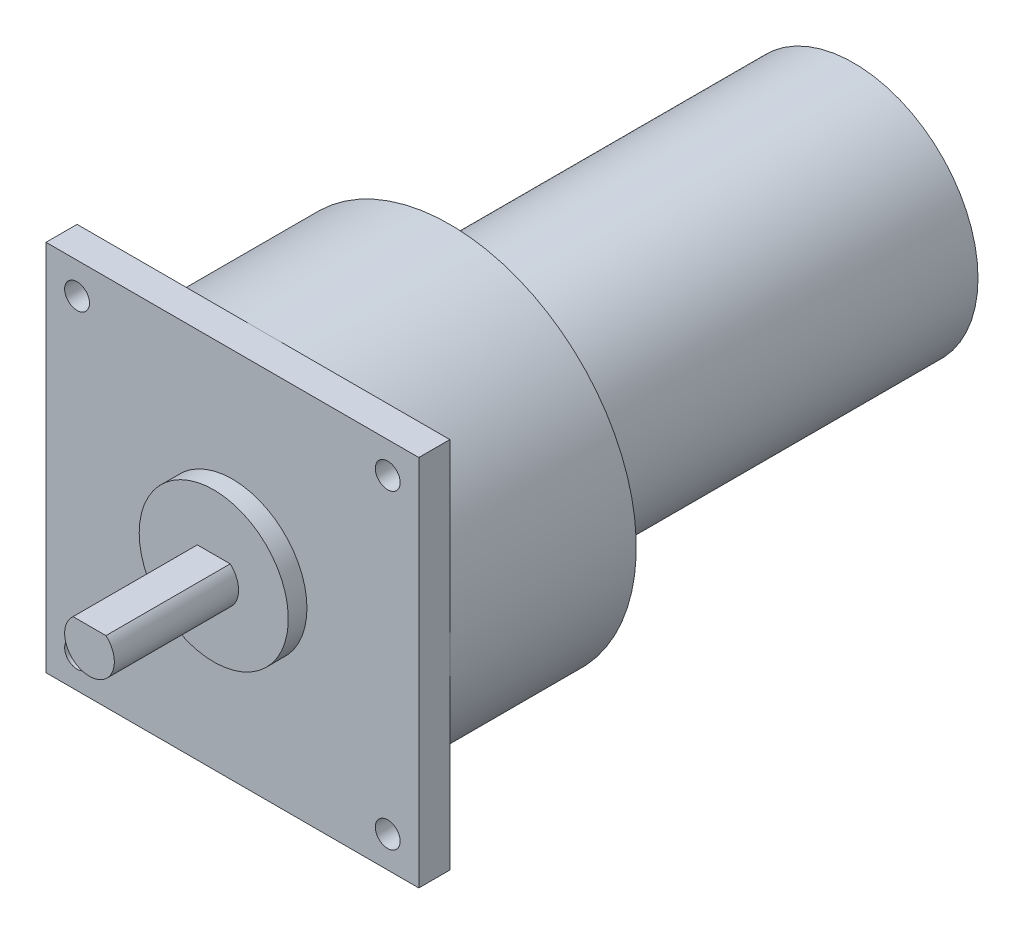
ISO-10303-21;
HEADER;
FILE_DESCRIPTION(('STEP AP214'),'2;1');
FILE_NAME('part.step','',(''),(''),'','','');
FILE_SCHEMA(('AUTOMOTIVE_DESIGN { 1 0 10303 214 1 1 1 1 }'));
ENDSEC;
DATA;
#1=APPLICATION_CONTEXT('core data for automotive mechanical design processes');
#2=APPLICATION_PROTOCOL_DEFINITION('international standard','automotive_design',2000,#1);
#3=PRODUCT_CONTEXT('',#1,'mechanical');
#4=PRODUCT('Part','Part','',(#3));
#5=PRODUCT_RELATED_PRODUCT_CATEGORY('part','',(#4));
#6=PRODUCT_DEFINITION_FORMATION('','',#4);
#7=PRODUCT_DEFINITION_CONTEXT('part definition',#1,'design');
#8=PRODUCT_DEFINITION('design','',#6,#7);
#9=PRODUCT_DEFINITION_SHAPE('','',#8);
#10=(LENGTH_UNIT() NAMED_UNIT(*) SI_UNIT(.MILLI.,.METRE.));
#11=(NAMED_UNIT(*) PLANE_ANGLE_UNIT() SI_UNIT($,.RADIAN.));
#12=(NAMED_UNIT(*) SI_UNIT($,.STERADIAN.) SOLID_ANGLE_UNIT());
#13=UNCERTAINTY_MEASURE_WITH_UNIT(LENGTH_MEASURE(1.E-05),#10,'distance_accuracy_value','');
#14=(GEOMETRIC_REPRESENTATION_CONTEXT(3) GLOBAL_UNCERTAINTY_ASSIGNED_CONTEXT((#13)) GLOBAL_UNIT_ASSIGNED_CONTEXT((#10,
#11,#12)) REPRESENTATION_CONTEXT('',''));
#15=CARTESIAN_POINT('',(0.,0.,0.));
#16=DIRECTION('',(0.,0.,1.));
#17=DIRECTION('',(1.,0.,0.));
#18=AXIS2_PLACEMENT_3D('',#15,#16,#17);
#19=CARTESIAN_POINT('',(0.,0.,-30.));
#20=DIRECTION('',(0.,0.,-1.));
#21=DIRECTION('',(-1.,0.,0.));
#22=AXIS2_PLACEMENT_3D('',#19,#20,#21);
#23=PLANE('',#22);
#24=CARTESIAN_POINT('',(0.,0.,-30.));
#25=DIRECTION('',(0.,0.,-1.));
#26=DIRECTION('',(-1.,0.,0.));
#27=AXIS2_PLACEMENT_3D('',#24,#25,#26);
#28=CIRCLE('',#27,30.);
#29=CARTESIAN_POINT('',(-30.,0.,-30.));
#30=VERTEX_POINT('',#29);
#31=EDGE_CURVE('E126',#30,#30,#28,.T.);
#32=ORIENTED_EDGE('',*,*,#31,.T.);
#33=EDGE_LOOP('',(#32));
#34=FACE_BOUND('',#33,.T.);
#35=CARTESIAN_POINT('',(0.,0.,-30.));
#36=DIRECTION('',(0.,0.,-1.));
#37=DIRECTION('',(-1.,0.,0.));
#38=AXIS2_PLACEMENT_3D('',#35,#36,#37);
#39=CIRCLE('',#38,20.);
#40=CARTESIAN_POINT('',(-20.,0.,-30.));
#41=VERTEX_POINT('',#40);
#42=EDGE_CURVE('E442',#41,#41,#39,.T.);
#43=ORIENTED_EDGE('',*,*,#42,.F.);
#44=EDGE_LOOP('',(#43));
#45=FACE_BOUND('',#44,.T.);
#46=ADVANCED_FACE('F35',(#34,#45),#23,.T.);
#47=CARTESIAN_POINT('',(0.,0.,0.));
#48=DIRECTION('',(0.,0.,1.));
#49=DIRECTION('',(1.,0.,0.));
#50=AXIS2_PLACEMENT_3D('',#47,#48,#49);
#51=PLANE('',#50);
#52=CARTESIAN_POINT('',(-25.,25.,0.));
#53=DIRECTION('',(0.,0.,-1.));
#54=DIRECTION('',(-1.,0.,0.));
#55=AXIS2_PLACEMENT_3D('',#52,#53,#54);
#56=CIRCLE('',#55,2.);
#57=CARTESIAN_POINT('',(-27.,25.,0.));
#58=VERTEX_POINT('',#57);
#59=EDGE_CURVE('E168',#58,#58,#56,.T.);
#60=ORIENTED_EDGE('',*,*,#59,.F.);
#61=EDGE_LOOP('',(#60));
#62=FACE_BOUND('',#61,.T.);
#63=CARTESIAN_POINT('',(0.,0.,0.));
#64=DIRECTION('',(0.,0.,-1.));
#65=DIRECTION('',(-1.,0.,0.));
#66=AXIS2_PLACEMENT_3D('',#63,#64,#65);
#67=CIRCLE('',#66,30.);
#68=CARTESIAN_POINT('',(-30.,0.,0.));
#69=VERTEX_POINT('',#68);
#70=CARTESIAN_POINT('',(0.,30.,0.));
#71=VERTEX_POINT('',#70);
#72=EDGE_CURVE('E46',#69,#71,#67,.T.);
#73=ORIENTED_EDGE('',*,*,#72,.F.);
#74=DIRECTION('',(0.,-1.,0.));
#75=VECTOR('',#74,1.);
#76=CARTESIAN_POINT('',(-30.,30.,0.));
#77=LINE('',#76,#75);
#78=CARTESIAN_POINT('',(-30.,30.,0.));
#79=VERTEX_POINT('',#78);
#80=EDGE_CURVE('E105',#79,#69,#77,.T.);
#81=ORIENTED_EDGE('',*,*,#80,.F.);
#82=DIRECTION('',(-1.,0.,0.));
#83=VECTOR('',#82,1.);
#84=CARTESIAN_POINT('',(-30.,30.,0.));
#85=LINE('',#84,#83);
#86=EDGE_CURVE('E123',#71,#79,#85,.T.);
#87=ORIENTED_EDGE('',*,*,#86,.F.);
#88=EDGE_LOOP('',(#73,#81,#87));
#89=FACE_BOUND('',#88,.T.);
#90=ADVANCED_FACE('F122',(#62,#89),#51,.F.);
#91=CARTESIAN_POINT('',(25.,25.,0.));
#92=DIRECTION('',(0.,0.,-1.));
#93=DIRECTION('',(-1.,0.,0.));
#94=AXIS2_PLACEMENT_3D('',#91,#92,#93);
#95=CIRCLE('',#94,2.);
#96=CARTESIAN_POINT('',(23.,25.,0.));
#97=VERTEX_POINT('',#96);
#98=EDGE_CURVE('E174',#97,#97,#95,.T.);
#99=ORIENTED_EDGE('',*,*,#98,.F.);
#100=EDGE_LOOP('',(#99));
#101=FACE_BOUND('',#100,.T.);
#102=CARTESIAN_POINT('',(30.,0.,0.));
#103=VERTEX_POINT('',#102);
#104=EDGE_CURVE('E11',#71,#103,#67,.T.);
#105=ORIENTED_EDGE('',*,*,#104,.F.);
#106=CARTESIAN_POINT('',(30.,30.,0.));
#107=VERTEX_POINT('',#106);
#108=EDGE_CURVE('E120',#107,#71,#85,.T.);
#109=ORIENTED_EDGE('',*,*,#108,.F.);
#110=DIRECTION('',(0.,1.,0.));
#111=VECTOR('',#110,1.);
#112=CARTESIAN_POINT('',(30.,30.,0.));
#113=LINE('',#112,#111);
#114=EDGE_CURVE('E180',#103,#107,#113,.T.);
#115=ORIENTED_EDGE('',*,*,#114,.F.);
#116=EDGE_LOOP('',(#105,#109,#115));
#117=FACE_BOUND('',#116,.T.);
#118=ADVANCED_FACE('F206',(#101,#117),#51,.F.);
#119=CARTESIAN_POINT('',(24.9999999999995,-25.,0.));
#120=DIRECTION('',(0.,0.,-1.));
#121=DIRECTION('',(-1.,0.,0.));
#122=AXIS2_PLACEMENT_3D('',#119,#120,#121);
#123=CIRCLE('',#122,2.);
#124=CARTESIAN_POINT('',(22.9999999999995,-25.,0.));
#125=VERTEX_POINT('',#124);
#126=EDGE_CURVE('E155',#125,#125,#123,.T.);
#127=ORIENTED_EDGE('',*,*,#126,.F.);
#128=EDGE_LOOP('',(#127));
#129=FACE_BOUND('',#128,.T.);
#130=CARTESIAN_POINT('',(0.,-30.,0.));
#131=VERTEX_POINT('',#130);
#132=EDGE_CURVE('E44',#103,#131,#67,.T.);
#133=ORIENTED_EDGE('',*,*,#132,.F.);
#134=CARTESIAN_POINT('',(30.,-30.,0.));
#135=VERTEX_POINT('',#134);
#136=EDGE_CURVE('E191',#135,#103,#113,.T.);
#137=ORIENTED_EDGE('',*,*,#136,.F.);
#138=DIRECTION('',(1.,0.,0.));
#139=VECTOR('',#138,1.);
#140=CARTESIAN_POINT('',(-30.,-30.,0.));
#141=LINE('',#140,#139);
#142=EDGE_CURVE('E115',#131,#135,#141,.T.);
#143=ORIENTED_EDGE('',*,*,#142,.F.);
#144=EDGE_LOOP('',(#133,#137,#143));
#145=FACE_BOUND('',#144,.T.);
#146=ADVANCED_FACE('F208',(#129,#145),#51,.F.);
#147=CARTESIAN_POINT('',(-25.0000000000005,-25.,0.));
#148=DIRECTION('',(0.,0.,-1.));
#149=DIRECTION('',(-1.,0.,0.));
#150=AXIS2_PLACEMENT_3D('',#147,#148,#149);
#151=CIRCLE('',#150,2.);
#152=CARTESIAN_POINT('',(-27.0000000000005,-25.,0.));
#153=VERTEX_POINT('',#152);
#154=EDGE_CURVE('E162',#153,#153,#151,.T.);
#155=ORIENTED_EDGE('',*,*,#154,.F.);
#156=EDGE_LOOP('',(#155));
#157=FACE_BOUND('',#156,.T.);
#158=EDGE_CURVE('E59',#131,#69,#67,.T.);
#159=ORIENTED_EDGE('',*,*,#158,.F.);
#160=CARTESIAN_POINT('',(-30.,-30.,0.));
#161=VERTEX_POINT('',#160);
#162=EDGE_CURVE('E119',#161,#131,#141,.T.);
#163=ORIENTED_EDGE('',*,*,#162,.F.);
#164=EDGE_CURVE('E108',#69,#161,#77,.T.);
#165=ORIENTED_EDGE('',*,*,#164,.F.);
#166=EDGE_LOOP('',(#159,#163,#165));
#167=FACE_BOUND('',#166,.T.);
#168=ADVANCED_FACE('F117',(#157,#167),#51,.F.);
#169=CARTESIAN_POINT('',(0.,0.,8.));
#170=DIRECTION('',(0.,0.,-1.));
#171=DIRECTION('',(-1.,0.,0.));
#172=AXIS2_PLACEMENT_3D('',#169,#170,#171);
#173=PLANE('',#172);
#174=CARTESIAN_POINT('',(0.,0.,8.));
#175=DIRECTION('',(0.,0.,-1.));
#176=DIRECTION('',(-1.,0.,0.));
#177=AXIS2_PLACEMENT_3D('',#174,#175,#176);
#178=CIRCLE('',#177,12.);
#179=CARTESIAN_POINT('',(-12.,0.,8.));
#180=VERTEX_POINT('',#179);
#181=EDGE_CURVE('E153',#180,#180,#178,.T.);
#182=ORIENTED_EDGE('',*,*,#181,.F.);
#183=EDGE_LOOP('',(#182));
#184=FACE_BOUND('',#183,.T.);
#185=CARTESIAN_POINT('',(0.,0.,8.));
#186=DIRECTION('',(0.,0.,1.));
#187=DIRECTION('',(1.,0.,0.));
#188=AXIS2_PLACEMENT_3D('',#185,#186,#187);
#189=CIRCLE('',#188,4.);
#190=CARTESIAN_POINT('',(-2.64575131106459,3.,8.));
#191=VERTEX_POINT('',#190);
#192=CARTESIAN_POINT('',(2.64575131106459,3.,8.));
#193=VERTEX_POINT('',#192);
#194=EDGE_CURVE('E143',#191,#193,#189,.T.);
#195=ORIENTED_EDGE('',*,*,#194,.F.);
#196=DIRECTION('',(-1.,0.,0.));
#197=VECTOR('',#196,1.);
#198=CARTESIAN_POINT('',(-2.64575131106459,3.,8.));
#199=LINE('',#198,#197);
#200=EDGE_CURVE('E140',#193,#191,#199,.T.);
#201=ORIENTED_EDGE('',*,*,#200,.F.);
#202=EDGE_LOOP('',(#195,#201));
#203=FACE_BOUND('',#202,.T.);
#204=ADVANCED_FACE('F247',(#184,#203),#173,.F.);
#205=CARTESIAN_POINT('',(30.,30.,5.));
#206=DIRECTION('',(-1.,0.,0.));
#207=DIRECTION('',(0.,-1.,0.));
#208=AXIS2_PLACEMENT_3D('',#205,#206,#207);
#209=PLANE('',#208);
#210=ORIENTED_EDGE('',*,*,#136,.T.);
#211=ORIENTED_EDGE('',*,*,#114,.T.);
#212=DIRECTION('',(0.,0.,-1.));
#213=VECTOR('',#212,1.);
#214=CARTESIAN_POINT('',(30.,30.,5.));
#215=LINE('',#214,#213);
#216=CARTESIAN_POINT('',(30.,30.,5.));
#217=VERTEX_POINT('',#216);
#218=EDGE_CURVE('E39',#217,#107,#215,.T.);
#219=ORIENTED_EDGE('',*,*,#218,.F.);
#220=DIRECTION('',(0.,1.,0.));
#221=VECTOR('',#220,1.);
#222=CARTESIAN_POINT('',(30.,30.,5.));
#223=LINE('',#222,#221);
#224=CARTESIAN_POINT('',(30.,-30.,5.));
#225=VERTEX_POINT('',#224);
#226=EDGE_CURVE('E181',#225,#217,#223,.T.);
#227=ORIENTED_EDGE('',*,*,#226,.F.);
#228=DIRECTION('',(0.,0.,-1.));
#229=VECTOR('',#228,1.);
#230=CARTESIAN_POINT('',(30.,-30.,5.));
#231=LINE('',#230,#229);
#232=EDGE_CURVE('E190',#225,#135,#231,.T.);
#233=ORIENTED_EDGE('',*,*,#232,.T.);
#234=EDGE_LOOP('',(#210,#211,#219,#227,#233));
#235=FACE_BOUND('',#234,.T.);
#236=ADVANCED_FACE('F37',(#235),#209,.F.);
#237=CARTESIAN_POINT('',(-30.,30.,5.));
#238=DIRECTION('',(0.,-1.,0.));
#239=DIRECTION('',(0.,0.,-1.));
#240=AXIS2_PLACEMENT_3D('',#237,#238,#239);
#241=PLANE('',#240);
#242=ORIENTED_EDGE('',*,*,#108,.T.);
#243=ORIENTED_EDGE('',*,*,#86,.T.);
#244=DIRECTION('',(0.,0.,-1.));
#245=VECTOR('',#244,1.);
#246=CARTESIAN_POINT('',(-30.,30.,5.));
#247=LINE('',#246,#245);
#248=CARTESIAN_POINT('',(-30.,30.,5.));
#249=VERTEX_POINT('',#248);
#250=EDGE_CURVE('E112',#249,#79,#247,.T.);
#251=ORIENTED_EDGE('',*,*,#250,.F.);
#252=DIRECTION('',(-1.,0.,0.));
#253=VECTOR('',#252,1.);
#254=CARTESIAN_POINT('',(-30.,30.,5.));
#255=LINE('',#254,#253);
#256=EDGE_CURVE('E184',#217,#249,#255,.T.);
#257=ORIENTED_EDGE('',*,*,#256,.F.);
#258=ORIENTED_EDGE('',*,*,#218,.T.);
#259=EDGE_LOOP('',(#242,#243,#251,#257,#258));
#260=FACE_BOUND('',#259,.T.);
#261=ADVANCED_FACE('F202',(#260),#241,.F.);
#262=CARTESIAN_POINT('',(-30.,30.,5.));
#263=DIRECTION('',(1.,0.,0.));
#264=DIRECTION('',(0.,1.,0.));
#265=AXIS2_PLACEMENT_3D('',#262,#263,#264);
#266=PLANE('',#265);
#267=ORIENTED_EDGE('',*,*,#80,.T.);
#268=ORIENTED_EDGE('',*,*,#164,.T.);
#269=DIRECTION('',(0.,0.,-1.));
#270=VECTOR('',#269,1.);
#271=CARTESIAN_POINT('',(-30.,-30.,5.));
#272=LINE('',#271,#270);
#273=CARTESIAN_POINT('',(-30.,-30.,5.));
#274=VERTEX_POINT('',#273);
#275=EDGE_CURVE('E198',#274,#161,#272,.T.);
#276=ORIENTED_EDGE('',*,*,#275,.F.);
#277=DIRECTION('',(0.,-1.,0.));
#278=VECTOR('',#277,1.);
#279=CARTESIAN_POINT('',(-30.,30.,5.));
#280=LINE('',#279,#278);
#281=EDGE_CURVE('E186',#249,#274,#280,.T.);
#282=ORIENTED_EDGE('',*,*,#281,.F.);
#283=ORIENTED_EDGE('',*,*,#250,.T.);
#284=EDGE_LOOP('',(#267,#268,#276,#282,#283));
#285=FACE_BOUND('',#284,.T.);
#286=ADVANCED_FACE('F106',(#285),#266,.F.);
#287=CARTESIAN_POINT('',(-30.,-30.,5.));
#288=DIRECTION('',(0.,1.,0.));
#289=DIRECTION('',(0.,0.,1.));
#290=AXIS2_PLACEMENT_3D('',#287,#288,#289);
#291=PLANE('',#290);
#292=ORIENTED_EDGE('',*,*,#162,.T.);
#293=ORIENTED_EDGE('',*,*,#142,.T.);
#294=ORIENTED_EDGE('',*,*,#232,.F.);
#295=DIRECTION('',(1.,0.,0.));
#296=VECTOR('',#295,1.);
#297=CARTESIAN_POINT('',(-30.,-30.,5.));
#298=LINE('',#297,#296);
#299=EDGE_CURVE('E188',#274,#225,#298,.T.);
#300=ORIENTED_EDGE('',*,*,#299,.F.);
#301=ORIENTED_EDGE('',*,*,#275,.T.);
#302=EDGE_LOOP('',(#292,#293,#294,#300,#301));
#303=FACE_BOUND('',#302,.T.);
#304=ADVANCED_FACE('F271',(#303),#291,.F.);
#305=CARTESIAN_POINT('',(0.,0.,5.));
#306=DIRECTION('',(0.,0.,1.));
#307=DIRECTION('',(1.,0.,0.));
#308=AXIS2_PLACEMENT_3D('',#305,#306,#307);
#309=PLANE('',#308);
#310=CARTESIAN_POINT('',(0.,0.,5.));
#311=DIRECTION('',(0.,0.,1.));
#312=DIRECTION('',(1.,0.,0.));
#313=AXIS2_PLACEMENT_3D('',#310,#311,#312);
#314=CIRCLE('',#313,12.);
#315=CARTESIAN_POINT('',(12.,0.,5.));
#316=VERTEX_POINT('',#315);
#317=EDGE_CURVE('E130',#316,#316,#314,.T.);
#318=ORIENTED_EDGE('',*,*,#317,.F.);
#319=EDGE_LOOP('',(#318));
#320=FACE_BOUND('',#319,.T.);
#321=CARTESIAN_POINT('',(24.9999999999995,-25.,5.));
#322=DIRECTION('',(0.,0.,1.));
#323=DIRECTION('',(1.,0.,0.));
#324=AXIS2_PLACEMENT_3D('',#321,#322,#323);
#325=CIRCLE('',#324,2.);
#326=CARTESIAN_POINT('',(26.9999999999995,-25.,5.));
#327=VERTEX_POINT('',#326);
#328=EDGE_CURVE('E159',#327,#327,#325,.F.);
#329=ORIENTED_EDGE('',*,*,#328,.T.);
#330=EDGE_LOOP('',(#329));
#331=FACE_BOUND('',#330,.T.);
#332=CARTESIAN_POINT('',(-25.0000000000005,-25.,5.));
#333=DIRECTION('',(0.,0.,1.));
#334=DIRECTION('',(1.,0.,0.));
#335=AXIS2_PLACEMENT_3D('',#332,#333,#334);
#336=CIRCLE('',#335,2.);
#337=CARTESIAN_POINT('',(-23.0000000000005,-25.,5.));
#338=VERTEX_POINT('',#337);
#339=EDGE_CURVE('E165',#338,#338,#336,.F.);
#340=ORIENTED_EDGE('',*,*,#339,.T.);
#341=EDGE_LOOP('',(#340));
#342=FACE_BOUND('',#341,.T.);
#343=CARTESIAN_POINT('',(-25.,25.,5.));
#344=DIRECTION('',(0.,0.,1.));
#345=DIRECTION('',(1.,0.,0.));
#346=AXIS2_PLACEMENT_3D('',#343,#344,#345);
#347=CIRCLE('',#346,2.);
#348=CARTESIAN_POINT('',(-23.,25.,5.));
#349=VERTEX_POINT('',#348);
#350=EDGE_CURVE('E171',#349,#349,#347,.F.);
#351=ORIENTED_EDGE('',*,*,#350,.T.);
#352=EDGE_LOOP('',(#351));
#353=FACE_BOUND('',#352,.T.);
#354=CARTESIAN_POINT('',(25.,25.,5.));
#355=DIRECTION('',(0.,0.,1.));
#356=DIRECTION('',(1.,0.,0.));
#357=AXIS2_PLACEMENT_3D('',#354,#355,#356);
#358=CIRCLE('',#357,2.);
#359=CARTESIAN_POINT('',(27.,25.,5.));
#360=VERTEX_POINT('',#359);
#361=EDGE_CURVE('E177',#360,#360,#358,.F.);
#362=ORIENTED_EDGE('',*,*,#361,.T.);
#363=EDGE_LOOP('',(#362));
#364=FACE_BOUND('',#363,.T.);
#365=ORIENTED_EDGE('',*,*,#226,.T.);
#366=ORIENTED_EDGE('',*,*,#256,.T.);
#367=ORIENTED_EDGE('',*,*,#281,.T.);
#368=ORIENTED_EDGE('',*,*,#299,.T.);
#369=EDGE_LOOP('',(#365,#366,#367,#368));
#370=FACE_BOUND('',#369,.T.);
#371=ADVANCED_FACE('F268',(#320,#331,#342,#353,#364,#370),#309,.T.);
#372=CARTESIAN_POINT('',(25.,25.,10.6568542494924));
#373=DIRECTION('',(0.,0.,-1.));
#374=DIRECTION('',(-1.,0.,0.));
#375=AXIS2_PLACEMENT_3D('',#372,#373,#374);
#376=CYLINDRICAL_SURFACE('',#375,2.);
#377=ORIENTED_EDGE('',*,*,#98,.T.);
#378=EDGE_LOOP('',(#377));
#379=FACE_BOUND('',#378,.T.);
#380=ORIENTED_EDGE('',*,*,#361,.F.);
#381=EDGE_LOOP('',(#380));
#382=FACE_BOUND('',#381,.T.);
#383=ADVANCED_FACE('F265',(#379,#382),#376,.F.);
#384=CARTESIAN_POINT('',(-25.,25.,10.6568542494924));
#385=DIRECTION('',(0.,0.,-1.));
#386=DIRECTION('',(-1.,0.,0.));
#387=AXIS2_PLACEMENT_3D('',#384,#385,#386);
#388=CYLINDRICAL_SURFACE('',#387,2.);
#389=ORIENTED_EDGE('',*,*,#59,.T.);
#390=EDGE_LOOP('',(#389));
#391=FACE_BOUND('',#390,.T.);
#392=ORIENTED_EDGE('',*,*,#350,.F.);
#393=EDGE_LOOP('',(#392));
#394=FACE_BOUND('',#393,.T.);
#395=ADVANCED_FACE('F261',(#391,#394),#388,.F.);
#396=CARTESIAN_POINT('',(-25.0000000000005,-25.,10.6568542494924));
#397=DIRECTION('',(0.,0.,-1.));
#398=DIRECTION('',(-1.,0.,0.));
#399=AXIS2_PLACEMENT_3D('',#396,#397,#398);
#400=CYLINDRICAL_SURFACE('',#399,2.);
#401=ORIENTED_EDGE('',*,*,#154,.T.);
#402=EDGE_LOOP('',(#401));
#403=FACE_BOUND('',#402,.T.);
#404=ORIENTED_EDGE('',*,*,#339,.F.);
#405=EDGE_LOOP('',(#404));
#406=FACE_BOUND('',#405,.T.);
#407=ADVANCED_FACE('F257',(#403,#406),#400,.F.);
#408=CARTESIAN_POINT('',(24.9999999999995,-25.,10.6568542494924));
#409=DIRECTION('',(0.,0.,-1.));
#410=DIRECTION('',(-1.,0.,0.));
#411=AXIS2_PLACEMENT_3D('',#408,#409,#410);
#412=CYLINDRICAL_SURFACE('',#411,2.);
#413=ORIENTED_EDGE('',*,*,#126,.T.);
#414=EDGE_LOOP('',(#413));
#415=FACE_BOUND('',#414,.T.);
#416=ORIENTED_EDGE('',*,*,#328,.F.);
#417=EDGE_LOOP('',(#416));
#418=FACE_BOUND('',#417,.T.);
#419=ADVANCED_FACE('F253',(#415,#418),#412,.F.);
#420=CARTESIAN_POINT('',(0.,0.,8.));
#421=DIRECTION('',(0.,0.,-1.));
#422=DIRECTION('',(-1.,0.,0.));
#423=AXIS2_PLACEMENT_3D('',#420,#421,#422);
#424=CYLINDRICAL_SURFACE('',#423,12.);
#425=ORIENTED_EDGE('',*,*,#317,.T.);
#426=EDGE_LOOP('',(#425));
#427=FACE_BOUND('',#426,.T.);
#428=ORIENTED_EDGE('',*,*,#181,.T.);
#429=EDGE_LOOP('',(#428));
#430=FACE_BOUND('',#429,.T.);
#431=ADVANCED_FACE('F245',(#427,#430),#424,.T.);
#432=CARTESIAN_POINT('',(0.,0.,28.));
#433=DIRECTION('',(0.,0.,-1.));
#434=DIRECTION('',(-1.,0.,0.));
#435=AXIS2_PLACEMENT_3D('',#432,#433,#434);
#436=CYLINDRICAL_SURFACE('',#435,4.);
#437=ORIENTED_EDGE('',*,*,#194,.T.);
#438=DIRECTION('',(0.,0.,-1.));
#439=VECTOR('',#438,1.);
#440=CARTESIAN_POINT('',(2.64575131106459,3.,28.));
#441=LINE('',#440,#439);
#442=CARTESIAN_POINT('',(2.64575131106459,3.,28.));
#443=VERTEX_POINT('',#442);
#444=EDGE_CURVE('E150',#443,#193,#441,.T.);
#445=ORIENTED_EDGE('',*,*,#444,.F.);
#446=CARTESIAN_POINT('',(0.,0.,28.));
#447=DIRECTION('',(0.,0.,1.));
#448=DIRECTION('',(1.,0.,0.));
#449=AXIS2_PLACEMENT_3D('',#446,#447,#448);
#450=CIRCLE('',#449,4.);
#451=CARTESIAN_POINT('',(-2.64575131106459,3.,28.));
#452=VERTEX_POINT('',#451);
#453=EDGE_CURVE('E136',#452,#443,#450,.T.);
#454=ORIENTED_EDGE('',*,*,#453,.F.);
#455=DIRECTION('',(0.,0.,-1.));
#456=VECTOR('',#455,1.);
#457=CARTESIAN_POINT('',(-2.64575131106459,3.,28.));
#458=LINE('',#457,#456);
#459=EDGE_CURVE('E142',#452,#191,#458,.T.);
#460=ORIENTED_EDGE('',*,*,#459,.T.);
#461=EDGE_LOOP('',(#437,#445,#454,#460));
#462=FACE_BOUND('',#461,.T.);
#463=ADVANCED_FACE('F241',(#462),#436,.T.);
#464=CARTESIAN_POINT('',(-2.64575131106459,3.,28.));
#465=DIRECTION('',(0.,-1.,0.));
#466=DIRECTION('',(0.,0.,-1.));
#467=AXIS2_PLACEMENT_3D('',#464,#465,#466);
#468=PLANE('',#467);
#469=ORIENTED_EDGE('',*,*,#200,.T.);
#470=ORIENTED_EDGE('',*,*,#459,.F.);
#471=DIRECTION('',(-1.,0.,0.));
#472=VECTOR('',#471,1.);
#473=CARTESIAN_POINT('',(-2.64575131106459,3.,28.));
#474=LINE('',#473,#472);
#475=EDGE_CURVE('E139',#443,#452,#474,.T.);
#476=ORIENTED_EDGE('',*,*,#475,.F.);
#477=ORIENTED_EDGE('',*,*,#444,.T.);
#478=EDGE_LOOP('',(#469,#470,#476,#477));
#479=FACE_BOUND('',#478,.T.);
#480=ADVANCED_FACE('F237',(#479),#468,.F.);
#481=CARTESIAN_POINT('',(0.,0.,28.));
#482=DIRECTION('',(0.,0.,1.));
#483=DIRECTION('',(1.,0.,0.));
#484=AXIS2_PLACEMENT_3D('',#481,#482,#483);
#485=PLANE('',#484);
#486=ORIENTED_EDGE('',*,*,#453,.T.);
#487=ORIENTED_EDGE('',*,*,#475,.T.);
#488=EDGE_LOOP('',(#486,#487));
#489=FACE_BOUND('',#488,.T.);
#490=ADVANCED_FACE('F233',(#489),#485,.T.);
#491=CARTESIAN_POINT('',(0.,0.,-30.));
#492=DIRECTION('',(0.,0.,1.));
#493=DIRECTION('',(1.,0.,0.));
#494=AXIS2_PLACEMENT_3D('',#491,#492,#493);
#495=CYLINDRICAL_SURFACE('',#494,30.);
#496=ORIENTED_EDGE('',*,*,#31,.F.);
#497=EDGE_LOOP('',(#496));
#498=FACE_BOUND('',#497,.T.);
#499=ORIENTED_EDGE('',*,*,#72,.T.);
#500=ORIENTED_EDGE('',*,*,#104,.T.);
#501=ORIENTED_EDGE('',*,*,#132,.T.);
#502=ORIENTED_EDGE('',*,*,#158,.T.);
#503=EDGE_LOOP('',(#499,#500,#501,#502));
#504=FACE_BOUND('',#503,.T.);
#505=ADVANCED_FACE('F129',(#498,#504),#495,.T.);
#506=CARTESIAN_POINT('',(0.,0.,-95.));
#507=DIRECTION('',(0.,0.,1.));
#508=DIRECTION('',(1.,0.,0.));
#509=AXIS2_PLACEMENT_3D('',#506,#507,#508);
#510=CYLINDRICAL_SURFACE('',#509,20.);
#511=CARTESIAN_POINT('',(0.,0.,-95.));
#512=DIRECTION('',(0.,0.,-1.));
#513=DIRECTION('',(-1.,0.,0.));
#514=AXIS2_PLACEMENT_3D('',#511,#512,#513);
#515=CIRCLE('',#514,20.);
#516=CARTESIAN_POINT('',(-20.,0.,-95.));
#517=VERTEX_POINT('',#516);
#518=EDGE_CURVE('E127',#517,#517,#515,.T.);
#519=ORIENTED_EDGE('',*,*,#518,.F.);
#520=EDGE_LOOP('',(#519));
#521=FACE_BOUND('',#520,.T.);
#522=ORIENTED_EDGE('',*,*,#42,.T.);
#523=EDGE_LOOP('',(#522));
#524=FACE_BOUND('',#523,.T.);
#525=ADVANCED_FACE('F229',(#521,#524),#510,.T.);
#526=CARTESIAN_POINT('',(0.,0.,-95.));
#527=DIRECTION('',(0.,0.,-1.));
#528=DIRECTION('',(-1.,0.,0.));
#529=AXIS2_PLACEMENT_3D('',#526,#527,#528);
#530=PLANE('',#529);
#531=ORIENTED_EDGE('',*,*,#518,.T.);
#532=EDGE_LOOP('',(#531));
#533=FACE_BOUND('',#532,.T.);
#534=ADVANCED_FACE('F426',(#533),#530,.T.);
#535=CLOSED_SHELL('',(#46,#90,#118,#146,#168,#204,#236,#261,#286,#304,#371,#383,#395,#407,#419,
#431,#463,#480,#490,#505,#525,#534));
#536=MANIFOLD_SOLID_BREP('B2',#535);
#537=ADVANCED_BREP_SHAPE_REPRESENTATION('',(#18,#536),#14);
#538=SHAPE_DEFINITION_REPRESENTATION(#9,#537);
ENDSEC;
END-ISO-10303-21;
